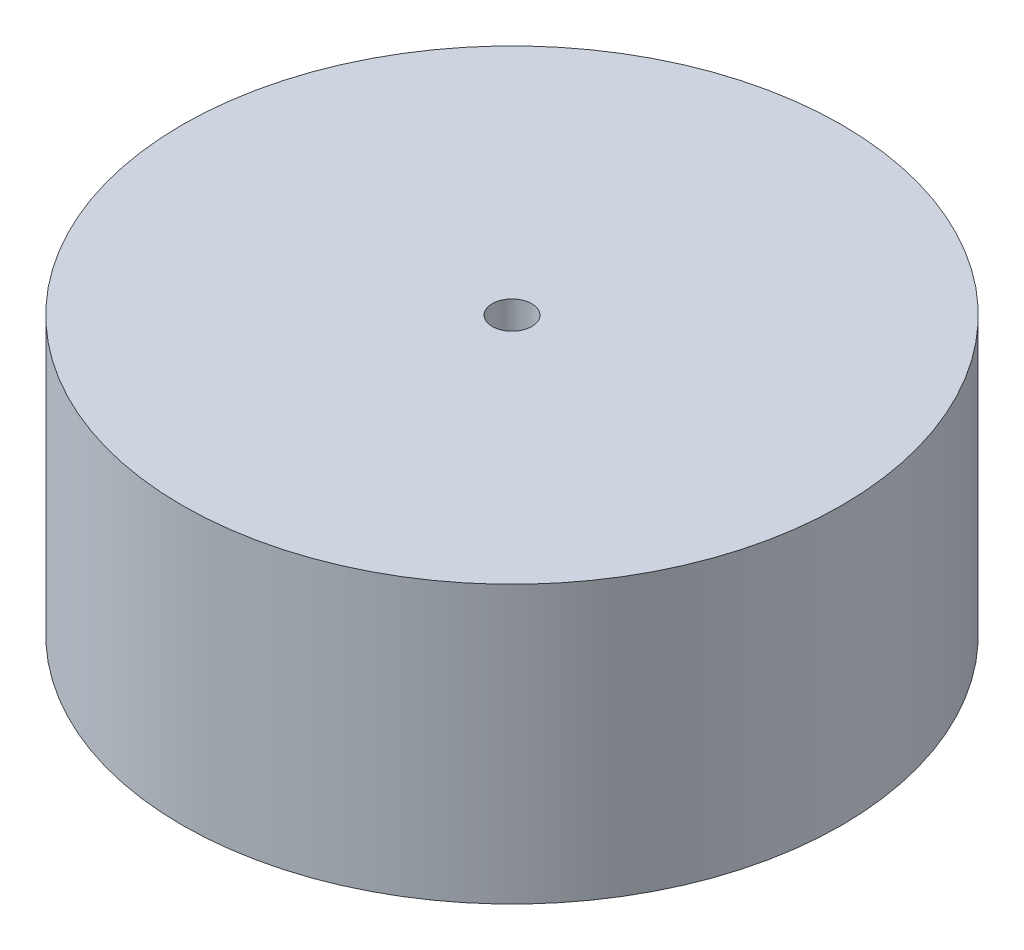
ISO-10303-21;
HEADER;
FILE_DESCRIPTION(('STEP AP214'),'2;1');
FILE_NAME('part.step','',(''),(''),'','','');
FILE_SCHEMA(('AUTOMOTIVE_DESIGN { 1 0 10303 214 1 1 1 1 }'));
ENDSEC;
DATA;
#1=APPLICATION_CONTEXT('core data for automotive mechanical design processes');
#2=APPLICATION_PROTOCOL_DEFINITION('international standard','automotive_design',2000,#1);
#3=PRODUCT_CONTEXT('',#1,'mechanical');
#4=PRODUCT('Part','Part','',(#3));
#5=PRODUCT_RELATED_PRODUCT_CATEGORY('part','',(#4));
#6=PRODUCT_DEFINITION_FORMATION('','',#4);
#7=PRODUCT_DEFINITION_CONTEXT('part definition',#1,'design');
#8=PRODUCT_DEFINITION('design','',#6,#7);
#9=PRODUCT_DEFINITION_SHAPE('','',#8);
#10=(LENGTH_UNIT() NAMED_UNIT(*) SI_UNIT(.MILLI.,.METRE.));
#11=(NAMED_UNIT(*) PLANE_ANGLE_UNIT() SI_UNIT($,.RADIAN.));
#12=(NAMED_UNIT(*) SI_UNIT($,.STERADIAN.) SOLID_ANGLE_UNIT());
#13=UNCERTAINTY_MEASURE_WITH_UNIT(LENGTH_MEASURE(1.E-05),#10,'distance_accuracy_value','');
#14=(GEOMETRIC_REPRESENTATION_CONTEXT(3) GLOBAL_UNCERTAINTY_ASSIGNED_CONTEXT((#13)) GLOBAL_UNIT_ASSIGNED_CONTEXT((#10,
#11,#12)) REPRESENTATION_CONTEXT('',''));
#15=CARTESIAN_POINT('',(0.,0.,0.));
#16=DIRECTION('',(0.,0.,1.));
#17=DIRECTION('',(1.,0.,0.));
#18=AXIS2_PLACEMENT_3D('',#15,#16,#17);
#19=CARTESIAN_POINT('',(0.,21.,0.));
#20=DIRECTION('',(0.,1.,0.));
#21=DIRECTION('',(0.,0.,1.));
#22=AXIS2_PLACEMENT_3D('',#19,#20,#21);
#23=PLANE('',#22);
#24=CARTESIAN_POINT('',(0.,21.,0.));
#25=DIRECTION('',(0.,1.,0.));
#26=DIRECTION('',(0.,0.,1.));
#27=AXIS2_PLACEMENT_3D('',#24,#25,#26);
#28=CIRCLE('',#27,25.);
#29=CARTESIAN_POINT('',(0.,21.,-25.));
#30=VERTEX_POINT('',#29);
#31=EDGE_CURVE('E10',#30,#30,#28,.T.);
#32=ORIENTED_EDGE('',*,*,#31,.T.);
#33=EDGE_LOOP('',(#32));
#34=FACE_BOUND('',#33,.T.);
#35=CARTESIAN_POINT('',(0.,21.,0.));
#36=DIRECTION('',(0.,1.,0.));
#37=DIRECTION('',(0.,0.,1.));
#38=AXIS2_PLACEMENT_3D('',#35,#36,#37);
#39=CIRCLE('',#38,1.5);
#40=CARTESIAN_POINT('',(0.,21.,-1.5));
#41=VERTEX_POINT('',#40);
#42=EDGE_CURVE('E39',#41,#41,#39,.T.);
#43=ORIENTED_EDGE('',*,*,#42,.F.);
#44=EDGE_LOOP('',(#43));
#45=FACE_BOUND('',#44,.T.);
#46=ADVANCED_FACE('F28',(#34,#45),#23,.T.);
#47=CARTESIAN_POINT('',(0.,0.,0.));
#48=DIRECTION('',(0.,1.,0.));
#49=DIRECTION('',(0.,0.,1.));
#50=AXIS2_PLACEMENT_3D('',#47,#48,#49);
#51=PLANE('',#50);
#52=CARTESIAN_POINT('',(0.,0.,0.));
#53=DIRECTION('',(0.,1.,0.));
#54=DIRECTION('',(0.,0.,1.));
#55=AXIS2_PLACEMENT_3D('',#52,#53,#54);
#56=CIRCLE('',#55,25.);
#57=CARTESIAN_POINT('',(0.,0.,-25.));
#58=VERTEX_POINT('',#57);
#59=EDGE_CURVE('E32',#58,#58,#56,.T.);
#60=ORIENTED_EDGE('',*,*,#59,.F.);
#61=EDGE_LOOP('',(#60));
#62=FACE_BOUND('',#61,.T.);
#63=CARTESIAN_POINT('',(0.,0.,0.));
#64=DIRECTION('',(0.,1.,0.));
#65=DIRECTION('',(0.,0.,1.));
#66=AXIS2_PLACEMENT_3D('',#63,#64,#65);
#67=CIRCLE('',#66,1.5);
#68=CARTESIAN_POINT('',(0.,0.,-1.5));
#69=VERTEX_POINT('',#68);
#70=EDGE_CURVE('E41',#69,#69,#67,.T.);
#71=ORIENTED_EDGE('',*,*,#70,.T.);
#72=EDGE_LOOP('',(#71));
#73=FACE_BOUND('',#72,.T.);
#74=ADVANCED_FACE('F51',(#62,#73),#51,.F.);
#75=CARTESIAN_POINT('',(0.,21.,0.));
#76=DIRECTION('',(0.,-1.,0.));
#77=DIRECTION('',(0.,0.,-1.));
#78=AXIS2_PLACEMENT_3D('',#75,#76,#77);
#79=CYLINDRICAL_SURFACE('',#78,25.);
#80=CARTESIAN_POINT('',(0.,21.,-25.));
#81=CARTESIAN_POINT('',(0.,20.78125,-25.));
#82=CARTESIAN_POINT('',(0.,20.5625,-25.));
#83=CARTESIAN_POINT('',(0.,20.125,-25.));
#84=CARTESIAN_POINT('',(0.,19.90625,-25.));
#85=CARTESIAN_POINT('',(0.,19.46875,-25.));
#86=CARTESIAN_POINT('',(0.,19.25,-25.));
#87=CARTESIAN_POINT('',(0.,18.8125,-25.));
#88=CARTESIAN_POINT('',(0.,18.59375,-25.));
#89=CARTESIAN_POINT('',(0.,18.15625,-25.));
#90=CARTESIAN_POINT('',(0.,17.9375,-25.));
#91=CARTESIAN_POINT('',(0.,17.5,-25.));
#92=CARTESIAN_POINT('',(0.,17.28125,-25.));
#93=CARTESIAN_POINT('',(0.,16.84375,-25.));
#94=CARTESIAN_POINT('',(0.,16.625,-25.));
#95=CARTESIAN_POINT('',(0.,16.1875,-25.));
#96=CARTESIAN_POINT('',(0.,15.96875,-25.));
#97=CARTESIAN_POINT('',(0.,15.53125,-25.));
#98=CARTESIAN_POINT('',(0.,15.3125,-25.));
#99=CARTESIAN_POINT('',(0.,14.875,-25.));
#100=CARTESIAN_POINT('',(0.,14.65625,-25.));
#101=CARTESIAN_POINT('',(0.,14.21875,-25.));
#102=CARTESIAN_POINT('',(0.,14.,-25.));
#103=CARTESIAN_POINT('',(0.,13.5625,-25.));
#104=CARTESIAN_POINT('',(0.,13.34375,-25.));
#105=CARTESIAN_POINT('',(0.,12.90625,-25.));
#106=CARTESIAN_POINT('',(0.,12.6875,-25.));
#107=CARTESIAN_POINT('',(0.,12.25,-25.));
#108=CARTESIAN_POINT('',(0.,12.03125,-25.));
#109=CARTESIAN_POINT('',(0.,11.59375,-25.));
#110=CARTESIAN_POINT('',(0.,11.375,-25.));
#111=CARTESIAN_POINT('',(0.,10.9375,-25.));
#112=CARTESIAN_POINT('',(0.,10.71875,-25.));
#113=CARTESIAN_POINT('',(0.,10.28125,-25.));
#114=CARTESIAN_POINT('',(0.,10.0625,-25.));
#115=CARTESIAN_POINT('',(0.,9.625,-25.));
#116=CARTESIAN_POINT('',(0.,9.40625,-25.));
#117=CARTESIAN_POINT('',(0.,8.96875,-25.));
#118=CARTESIAN_POINT('',(0.,8.75,-25.));
#119=CARTESIAN_POINT('',(0.,8.3125,-25.));
#120=CARTESIAN_POINT('',(0.,8.09375,-25.));
#121=CARTESIAN_POINT('',(0.,7.65625,-25.));
#122=CARTESIAN_POINT('',(0.,7.4375,-25.));
#123=CARTESIAN_POINT('',(0.,7.,-25.));
#124=CARTESIAN_POINT('',(0.,6.78125,-25.));
#125=CARTESIAN_POINT('',(0.,6.34375,-25.));
#126=CARTESIAN_POINT('',(0.,6.125,-25.));
#127=CARTESIAN_POINT('',(0.,5.6875,-25.));
#128=CARTESIAN_POINT('',(0.,5.46875,-25.));
#129=CARTESIAN_POINT('',(0.,5.03125,-25.));
#130=CARTESIAN_POINT('',(0.,4.8125,-25.));
#131=CARTESIAN_POINT('',(0.,4.375,-25.));
#132=CARTESIAN_POINT('',(0.,4.15625,-25.));
#133=CARTESIAN_POINT('',(0.,3.71875,-25.));
#134=CARTESIAN_POINT('',(0.,3.5,-25.));
#135=CARTESIAN_POINT('',(0.,3.0625,-25.));
#136=CARTESIAN_POINT('',(0.,2.84375,-25.));
#137=CARTESIAN_POINT('',(0.,2.40625,-25.));
#138=CARTESIAN_POINT('',(0.,2.1875,-25.));
#139=CARTESIAN_POINT('',(0.,1.75,-25.));
#140=CARTESIAN_POINT('',(0.,1.53125,-25.));
#141=CARTESIAN_POINT('',(0.,1.09375,-25.));
#142=CARTESIAN_POINT('',(0.,0.875000000000001,-25.));
#143=CARTESIAN_POINT('',(0.,0.4375,-25.));
#144=CARTESIAN_POINT('',(0.,0.21875,-25.));
#145=CARTESIAN_POINT('',(0.,0.,-25.));
#146=B_SPLINE_CURVE_WITH_KNOTS('',3,(#80,#81,#82,#83,#84,#85,#86,#87,#88,#89,#90,#91,#92,#93,
#94,#95,#96,#97,#98,#99,#100,#101,#102,#103,#104,#105,#106,#107,#108,#109,#110,#111,#112,#113,
#114,#115,#116,#117,#118,#119,#120,#121,#122,#123,#124,#125,#126,#127,#128,#129,#130,#131,#132,
#133,#134,#135,#136,#137,#138,#139,#140,#141,#142,#143,#144,#145),.UNSPECIFIED.,.F.,.F.,(4,2,2,
2,2,2,2,2,2,2,2,2,2,2,2,2,2,2,2,2,2,2,2,2,2,2,2,2,2,2,2,2,4),(0.,0.656249999999997,1.3125,
1.96875,2.625,3.28125,3.9375,4.59375,5.25,5.90625,6.5625,7.21875,7.875,8.53125,9.1875,9.84375,
10.5,11.15625,11.8125,12.46875,13.125,13.78125,14.4375,15.09375,15.75,16.40625,17.0625,17.71875,
18.375,19.03125,19.6875,20.34375,21.),.UNSPECIFIED.);
#147=EDGE_CURVE('BSEAM30',#30,#58,#146,.T.);
#148=ORIENTED_EDGE('',*,*,#31,.F.);
#149=ORIENTED_EDGE('',*,*,#59,.T.);
#150=ORIENTED_EDGE('',*,*,#147,.T.);
#151=ORIENTED_EDGE('',*,*,#147,.F.);
#152=EDGE_LOOP('',(#148,#150,#149,#151));
#153=FACE_BOUND('',#152,.T.);
#154=ADVANCED_FACE('F30',(#153),#79,.T.);
#155=CARTESIAN_POINT('',(0.,21.,0.));
#156=DIRECTION('',(0.,-1.,0.));
#157=DIRECTION('',(0.,0.,-1.));
#158=AXIS2_PLACEMENT_3D('',#155,#156,#157);
#159=CYLINDRICAL_SURFACE('',#158,1.5);
#160=CARTESIAN_POINT('',(0.,21.,-1.5));
#161=CARTESIAN_POINT('',(0.,20.78125,-1.5));
#162=CARTESIAN_POINT('',(0.,20.5625,-1.5));
#163=CARTESIAN_POINT('',(0.,20.125,-1.5));
#164=CARTESIAN_POINT('',(0.,19.90625,-1.5));
#165=CARTESIAN_POINT('',(0.,19.46875,-1.5));
#166=CARTESIAN_POINT('',(0.,19.25,-1.5));
#167=CARTESIAN_POINT('',(0.,18.8125,-1.5));
#168=CARTESIAN_POINT('',(0.,18.59375,-1.5));
#169=CARTESIAN_POINT('',(0.,18.15625,-1.5));
#170=CARTESIAN_POINT('',(0.,17.9375,-1.5));
#171=CARTESIAN_POINT('',(0.,17.5,-1.5));
#172=CARTESIAN_POINT('',(0.,17.28125,-1.5));
#173=CARTESIAN_POINT('',(0.,16.84375,-1.5));
#174=CARTESIAN_POINT('',(0.,16.625,-1.5));
#175=CARTESIAN_POINT('',(0.,16.1875,-1.5));
#176=CARTESIAN_POINT('',(0.,15.96875,-1.5));
#177=CARTESIAN_POINT('',(0.,15.53125,-1.5));
#178=CARTESIAN_POINT('',(0.,15.3125,-1.5));
#179=CARTESIAN_POINT('',(0.,14.875,-1.5));
#180=CARTESIAN_POINT('',(0.,14.65625,-1.5));
#181=CARTESIAN_POINT('',(0.,14.21875,-1.5));
#182=CARTESIAN_POINT('',(0.,14.,-1.5));
#183=CARTESIAN_POINT('',(0.,13.5625,-1.5));
#184=CARTESIAN_POINT('',(0.,13.34375,-1.5));
#185=CARTESIAN_POINT('',(0.,12.90625,-1.5));
#186=CARTESIAN_POINT('',(0.,12.6875,-1.5));
#187=CARTESIAN_POINT('',(0.,12.25,-1.5));
#188=CARTESIAN_POINT('',(0.,12.03125,-1.5));
#189=CARTESIAN_POINT('',(0.,11.59375,-1.5));
#190=CARTESIAN_POINT('',(0.,11.375,-1.5));
#191=CARTESIAN_POINT('',(0.,10.9375,-1.5));
#192=CARTESIAN_POINT('',(0.,10.71875,-1.5));
#193=CARTESIAN_POINT('',(0.,10.28125,-1.5));
#194=CARTESIAN_POINT('',(0.,10.0625,-1.5));
#195=CARTESIAN_POINT('',(0.,9.625,-1.5));
#196=CARTESIAN_POINT('',(0.,9.40625,-1.5));
#197=CARTESIAN_POINT('',(0.,8.96875,-1.5));
#198=CARTESIAN_POINT('',(0.,8.75,-1.5));
#199=CARTESIAN_POINT('',(0.,8.3125,-1.5));
#200=CARTESIAN_POINT('',(0.,8.09375,-1.5));
#201=CARTESIAN_POINT('',(0.,7.65625,-1.5));
#202=CARTESIAN_POINT('',(0.,7.4375,-1.5));
#203=CARTESIAN_POINT('',(0.,7.,-1.5));
#204=CARTESIAN_POINT('',(0.,6.78125,-1.5));
#205=CARTESIAN_POINT('',(0.,6.34375,-1.5));
#206=CARTESIAN_POINT('',(0.,6.125,-1.5));
#207=CARTESIAN_POINT('',(0.,5.6875,-1.5));
#208=CARTESIAN_POINT('',(0.,5.46875,-1.5));
#209=CARTESIAN_POINT('',(0.,5.03125,-1.5));
#210=CARTESIAN_POINT('',(0.,4.8125,-1.5));
#211=CARTESIAN_POINT('',(0.,4.375,-1.5));
#212=CARTESIAN_POINT('',(0.,4.15625,-1.5));
#213=CARTESIAN_POINT('',(0.,3.71875,-1.5));
#214=CARTESIAN_POINT('',(0.,3.5,-1.5));
#215=CARTESIAN_POINT('',(0.,3.0625,-1.5));
#216=CARTESIAN_POINT('',(0.,2.84375,-1.5));
#217=CARTESIAN_POINT('',(0.,2.40625,-1.5));
#218=CARTESIAN_POINT('',(0.,2.1875,-1.5));
#219=CARTESIAN_POINT('',(0.,1.75,-1.5));
#220=CARTESIAN_POINT('',(0.,1.53125,-1.5));
#221=CARTESIAN_POINT('',(0.,1.09375,-1.5));
#222=CARTESIAN_POINT('',(0.,0.875000000000001,-1.5));
#223=CARTESIAN_POINT('',(0.,0.4375,-1.5));
#224=CARTESIAN_POINT('',(0.,0.21875,-1.5));
#225=CARTESIAN_POINT('',(0.,0.,-1.5));
#226=B_SPLINE_CURVE_WITH_KNOTS('',3,(#160,#161,#162,#163,#164,#165,#166,#167,#168,#169,#170,
#171,#172,#173,#174,#175,#176,#177,#178,#179,#180,#181,#182,#183,#184,#185,#186,#187,#188,#189,
#190,#191,#192,#193,#194,#195,#196,#197,#198,#199,#200,#201,#202,#203,#204,#205,#206,#207,#208,
#209,#210,#211,#212,#213,#214,#215,#216,#217,#218,#219,#220,#221,#222,#223,#224,#225),
.UNSPECIFIED.,.F.,.F.,(4,2,2,2,2,2,2,2,2,2,2,2,2,2,2,2,2,2,2,2,2,2,2,2,2,2,2,2,2,2,2,2,4),(0.,
0.656249999999997,1.3125,1.96875,2.625,3.28125,3.9375,4.59375,5.25,5.90625,6.5625,7.21875,7.875,
8.53125,9.1875,9.84375,10.5,11.15625,11.8125,12.46875,13.125,13.78125,14.4375,15.09375,15.75,
16.40625,17.0625,17.71875,18.375,19.03125,19.6875,20.34375,21.),.UNSPECIFIED.);
#227=EDGE_CURVE('BSEAM47',#41,#69,#226,.T.);
#228=ORIENTED_EDGE('',*,*,#42,.T.);
#229=ORIENTED_EDGE('',*,*,#70,.F.);
#230=ORIENTED_EDGE('',*,*,#227,.T.);
#231=ORIENTED_EDGE('',*,*,#227,.F.);
#232=EDGE_LOOP('',(#228,#230,#229,#231));
#233=FACE_BOUND('',#232,.T.);
#234=ADVANCED_FACE('F47',(#233),#159,.F.);
#235=CLOSED_SHELL('',(#46,#74,#154,#234));
#236=MANIFOLD_SOLID_BREP('B2',#235);
#237=ADVANCED_BREP_SHAPE_REPRESENTATION('',(#18,#236),#14);
#238=SHAPE_DEFINITION_REPRESENTATION(#9,#237);
ENDSEC;
END-ISO-10303-21;
